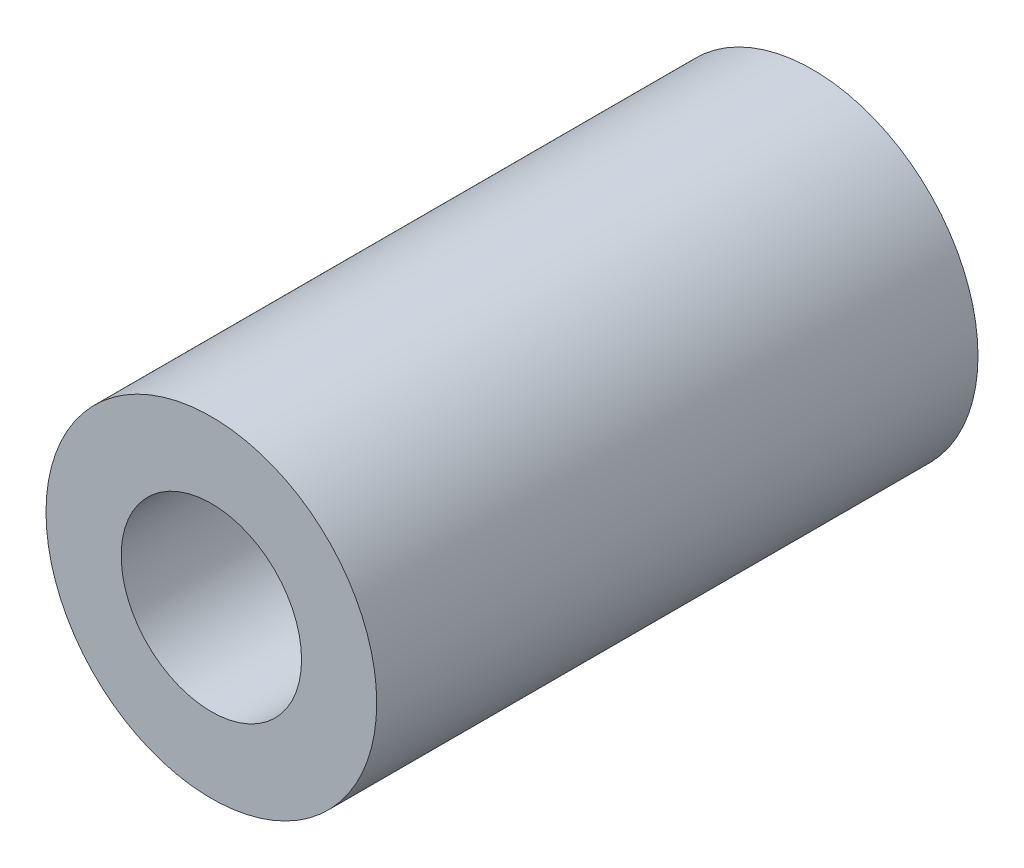
ISO-10303-21;
HEADER;
FILE_DESCRIPTION(('STEP AP214'),'2;1');
FILE_NAME('part.step','',(''),(''),'','','');
FILE_SCHEMA(('AUTOMOTIVE_DESIGN { 1 0 10303 214 1 1 1 1 }'));
ENDSEC;
DATA;
#1=APPLICATION_CONTEXT('core data for automotive mechanical design processes');
#2=APPLICATION_PROTOCOL_DEFINITION('international standard','automotive_design',2000,#1);
#3=PRODUCT_CONTEXT('',#1,'mechanical');
#4=PRODUCT('Part','Part','',(#3));
#5=PRODUCT_RELATED_PRODUCT_CATEGORY('part','',(#4));
#6=PRODUCT_DEFINITION_FORMATION('','',#4);
#7=PRODUCT_DEFINITION_CONTEXT('part definition',#1,'design');
#8=PRODUCT_DEFINITION('design','',#6,#7);
#9=PRODUCT_DEFINITION_SHAPE('','',#8);
#10=(LENGTH_UNIT() NAMED_UNIT(*) SI_UNIT(.MILLI.,.METRE.));
#11=(NAMED_UNIT(*) PLANE_ANGLE_UNIT() SI_UNIT($,.RADIAN.));
#12=(NAMED_UNIT(*) SI_UNIT($,.STERADIAN.) SOLID_ANGLE_UNIT());
#13=UNCERTAINTY_MEASURE_WITH_UNIT(LENGTH_MEASURE(1.E-05),#10,'distance_accuracy_value','');
#14=(GEOMETRIC_REPRESENTATION_CONTEXT(3) GLOBAL_UNCERTAINTY_ASSIGNED_CONTEXT((#13)) GLOBAL_UNIT_ASSIGNED_CONTEXT((#10,
#11,#12)) REPRESENTATION_CONTEXT('',''));
#15=CARTESIAN_POINT('',(0.,0.,0.));
#16=DIRECTION('',(0.,0.,1.));
#17=DIRECTION('',(1.,0.,0.));
#18=AXIS2_PLACEMENT_3D('',#15,#16,#17);
#19=CARTESIAN_POINT('',(0.,0.,20.));
#20=DIRECTION('',(0.,0.,1.));
#21=DIRECTION('',(1.,0.,0.));
#22=AXIS2_PLACEMENT_3D('',#19,#20,#21);
#23=PLANE('',#22);
#24=CARTESIAN_POINT('',(0.,0.,20.));
#25=DIRECTION('',(0.,0.,1.));
#26=DIRECTION('',(1.,0.,0.));
#27=AXIS2_PLACEMENT_3D('',#24,#25,#26);
#28=CIRCLE('',#27,5.5);
#29=CARTESIAN_POINT('',(5.5,0.,20.));
#30=VERTEX_POINT('',#29);
#31=EDGE_CURVE('E10',#30,#30,#28,.T.);
#32=ORIENTED_EDGE('',*,*,#31,.T.);
#33=EDGE_LOOP('',(#32));
#34=FACE_BOUND('',#33,.T.);
#35=CARTESIAN_POINT('',(0.,0.,20.));
#36=DIRECTION('',(0.,0.,1.));
#37=DIRECTION('',(1.,0.,0.));
#38=AXIS2_PLACEMENT_3D('',#35,#36,#37);
#39=CIRCLE('',#38,3.);
#40=CARTESIAN_POINT('',(3.,0.,20.));
#41=VERTEX_POINT('',#40);
#42=EDGE_CURVE('E48',#41,#41,#39,.T.);
#43=ORIENTED_EDGE('',*,*,#42,.F.);
#44=EDGE_LOOP('',(#43));
#45=FACE_BOUND('',#44,.T.);
#46=ADVANCED_FACE('F37',(#34,#45),#23,.T.);
#47=CARTESIAN_POINT('',(0.,0.,0.));
#48=DIRECTION('',(0.,0.,1.));
#49=DIRECTION('',(1.,0.,0.));
#50=AXIS2_PLACEMENT_3D('',#47,#48,#49);
#51=PLANE('',#50);
#52=CARTESIAN_POINT('',(0.,0.,0.));
#53=DIRECTION('',(0.,0.,1.));
#54=DIRECTION('',(1.,0.,0.));
#55=AXIS2_PLACEMENT_3D('',#52,#53,#54);
#56=CIRCLE('',#55,5.5);
#57=CARTESIAN_POINT('',(5.5,0.,0.));
#58=VERTEX_POINT('',#57);
#59=EDGE_CURVE('E41',#58,#58,#56,.T.);
#60=ORIENTED_EDGE('',*,*,#59,.F.);
#61=EDGE_LOOP('',(#60));
#62=FACE_BOUND('',#61,.T.);
#63=CARTESIAN_POINT('',(0.,0.,0.));
#64=DIRECTION('',(0.,0.,1.));
#65=DIRECTION('',(1.,0.,0.));
#66=AXIS2_PLACEMENT_3D('',#63,#64,#65);
#67=CIRCLE('',#66,3.);
#68=CARTESIAN_POINT('',(3.,0.,0.));
#69=VERTEX_POINT('',#68);
#70=EDGE_CURVE('E50',#69,#69,#67,.T.);
#71=ORIENTED_EDGE('',*,*,#70,.T.);
#72=EDGE_LOOP('',(#71));
#73=FACE_BOUND('',#72,.T.);
#74=ADVANCED_FACE('F60',(#62,#73),#51,.F.);
#75=CARTESIAN_POINT('',(0.,0.,20.));
#76=DIRECTION('',(0.,0.,-1.));
#77=DIRECTION('',(-1.,0.,0.));
#78=AXIS2_PLACEMENT_3D('',#75,#76,#77);
#79=CYLINDRICAL_SURFACE('',#78,5.5);
#80=ORIENTED_EDGE('',*,*,#31,.F.);
#81=EDGE_LOOP('',(#80));
#82=FACE_BOUND('',#81,.T.);
#83=ORIENTED_EDGE('',*,*,#59,.T.);
#84=EDGE_LOOP('',(#83));
#85=FACE_BOUND('',#84,.T.);
#86=ADVANCED_FACE('F39',(#82,#85),#79,.T.);
#87=CARTESIAN_POINT('',(0.,0.,20.));
#88=DIRECTION('',(0.,0.,-1.));
#89=DIRECTION('',(-1.,0.,0.));
#90=AXIS2_PLACEMENT_3D('',#87,#88,#89);
#91=CYLINDRICAL_SURFACE('',#90,3.);
#92=ORIENTED_EDGE('',*,*,#42,.T.);
#93=EDGE_LOOP('',(#92));
#94=FACE_BOUND('',#93,.T.);
#95=ORIENTED_EDGE('',*,*,#70,.F.);
#96=EDGE_LOOP('',(#95));
#97=FACE_BOUND('',#96,.T.);
#98=ADVANCED_FACE('F56',(#94,#97),#91,.F.);
#99=CLOSED_SHELL('',(#46,#74,#86,#98));
#100=MANIFOLD_SOLID_BREP('B2',#99);
#101=ADVANCED_BREP_SHAPE_REPRESENTATION('',(#18,#100),#14);
#102=SHAPE_DEFINITION_REPRESENTATION(#9,#101);
ENDSEC;
END-ISO-10303-21;
